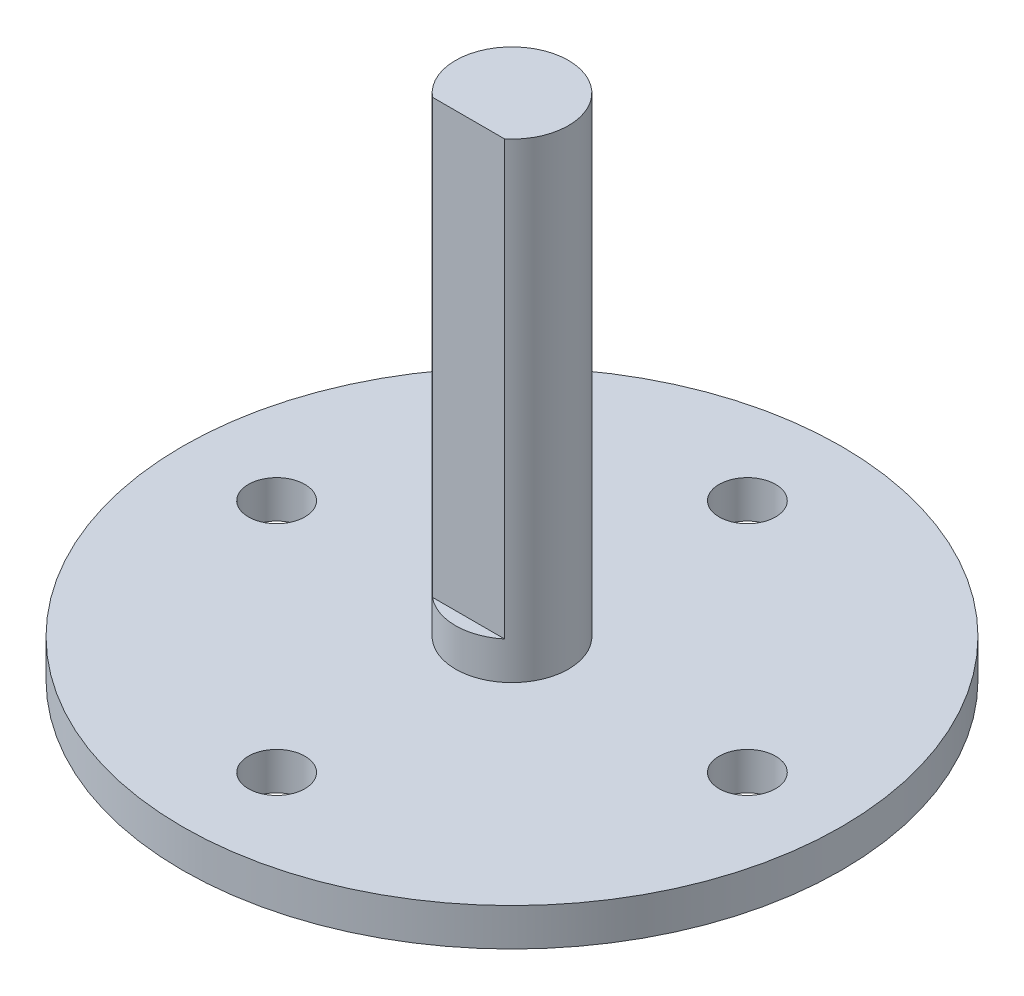
ISO-10303-21;
HEADER;
FILE_DESCRIPTION(('STEP AP214'),'2;1');
FILE_NAME('part.step','',(''),(''),'','','');
FILE_SCHEMA(('AUTOMOTIVE_DESIGN { 1 0 10303 214 1 1 1 1 }'));
ENDSEC;
DATA;
#1=APPLICATION_CONTEXT('core data for automotive mechanical design processes');
#2=APPLICATION_PROTOCOL_DEFINITION('international standard','automotive_design',2000,#1);
#3=PRODUCT_CONTEXT('',#1,'mechanical');
#4=PRODUCT('Part','Part','',(#3));
#5=PRODUCT_RELATED_PRODUCT_CATEGORY('part','',(#4));
#6=PRODUCT_DEFINITION_FORMATION('','',#4);
#7=PRODUCT_DEFINITION_CONTEXT('part definition',#1,'design');
#8=PRODUCT_DEFINITION('design','',#6,#7);
#9=PRODUCT_DEFINITION_SHAPE('','',#8);
#10=(LENGTH_UNIT() NAMED_UNIT(*) SI_UNIT(.MILLI.,.METRE.));
#11=(NAMED_UNIT(*) PLANE_ANGLE_UNIT() SI_UNIT($,.RADIAN.));
#12=(NAMED_UNIT(*) SI_UNIT($,.STERADIAN.) SOLID_ANGLE_UNIT());
#13=UNCERTAINTY_MEASURE_WITH_UNIT(LENGTH_MEASURE(1.E-05),#10,'distance_accuracy_value','');
#14=(GEOMETRIC_REPRESENTATION_CONTEXT(3) GLOBAL_UNCERTAINTY_ASSIGNED_CONTEXT((#13)) GLOBAL_UNIT_ASSIGNED_CONTEXT((#10,
#11,#12)) REPRESENTATION_CONTEXT('',''));
#15=CARTESIAN_POINT('',(0.,0.,0.));
#16=DIRECTION('',(0.,0.,1.));
#17=DIRECTION('',(1.,0.,0.));
#18=AXIS2_PLACEMENT_3D('',#15,#16,#17);
#19=CARTESIAN_POINT('',(0.,2.,0.));
#20=DIRECTION('',(0.,1.,0.));
#21=DIRECTION('',(0.,0.,1.));
#22=AXIS2_PLACEMENT_3D('',#19,#20,#21);
#23=PLANE('',#22);
#24=CARTESIAN_POINT('',(7.05950310263298E-13,2.,12.5));
#25=DIRECTION('',(0.,1.,0.));
#26=DIRECTION('',(0.,0.,1.));
#27=AXIS2_PLACEMENT_3D('',#24,#25,#26);
#28=CIRCLE('',#27,1.5);
#29=CARTESIAN_POINT('',(7.05950310263298E-13,2.,14.));
#30=VERTEX_POINT('',#29);
#31=EDGE_CURVE('E89',#30,#30,#28,.T.);
#32=ORIENTED_EDGE('',*,*,#31,.F.);
#33=EDGE_LOOP('',(#32));
#34=FACE_BOUND('',#33,.T.);
#35=CARTESIAN_POINT('',(0.,2.,-12.5));
#36=DIRECTION('',(0.,1.,0.));
#37=DIRECTION('',(0.,0.,1.));
#38=AXIS2_PLACEMENT_3D('',#35,#36,#37);
#39=CIRCLE('',#38,1.5);
#40=CARTESIAN_POINT('',(0.,2.,-11.));
#41=VERTEX_POINT('',#40);
#42=EDGE_CURVE('E101',#41,#41,#39,.T.);
#43=ORIENTED_EDGE('',*,*,#42,.F.);
#44=EDGE_LOOP('',(#43));
#45=FACE_BOUND('',#44,.T.);
#46=CARTESIAN_POINT('',(0.,2.,0.));
#47=DIRECTION('',(0.,1.,0.));
#48=DIRECTION('',(0.,0.,1.));
#49=AXIS2_PLACEMENT_3D('',#46,#47,#48);
#50=CIRCLE('',#49,17.5);
#51=CARTESIAN_POINT('',(0.,2.,17.5));
#52=VERTEX_POINT('',#51);
#53=EDGE_CURVE('E47',#52,#52,#50,.T.);
#54=ORIENTED_EDGE('',*,*,#53,.T.);
#55=EDGE_LOOP('',(#54));
#56=FACE_BOUND('',#55,.T.);
#57=CARTESIAN_POINT('',(12.5000000000004,2.,-3.52975155131649E-13));
#58=DIRECTION('',(0.,1.,0.));
#59=DIRECTION('',(0.,0.,1.));
#60=AXIS2_PLACEMENT_3D('',#57,#58,#59);
#61=CIRCLE('',#60,1.5);
#62=CARTESIAN_POINT('',(12.5000000000004,2.,1.49999999999965));
#63=VERTEX_POINT('',#62);
#64=EDGE_CURVE('E95',#63,#63,#61,.T.);
#65=ORIENTED_EDGE('',*,*,#64,.F.);
#66=EDGE_LOOP('',(#65));
#67=FACE_BOUND('',#66,.T.);
#68=CARTESIAN_POINT('',(-12.4999999999996,2.,3.54505963630583E-13));
#69=DIRECTION('',(0.,1.,0.));
#70=DIRECTION('',(0.,0.,1.));
#71=AXIS2_PLACEMENT_3D('',#68,#69,#70);
#72=CIRCLE('',#71,1.5);
#73=CARTESIAN_POINT('',(-12.4999999999996,2.,1.50000000000036));
#74=VERTEX_POINT('',#73);
#75=EDGE_CURVE('E81',#74,#74,#72,.T.);
#76=ORIENTED_EDGE('',*,*,#75,.F.);
#77=EDGE_LOOP('',(#76));
#78=FACE_BOUND('',#77,.T.);
#79=CARTESIAN_POINT('',(0.,2.,0.));
#80=DIRECTION('',(0.,1.,0.));
#81=DIRECTION('',(0.,0.,1.));
#82=AXIS2_PLACEMENT_3D('',#79,#80,#81);
#83=CIRCLE('',#82,3.);
#84=CARTESIAN_POINT('',(0.,2.,3.));
#85=VERTEX_POINT('',#84);
#86=EDGE_CURVE('E75',#85,#85,#83,.T.);
#87=ORIENTED_EDGE('',*,*,#86,.F.);
#88=EDGE_LOOP('',(#87));
#89=FACE_BOUND('',#88,.T.);
#90=ADVANCED_FACE('F39',(#34,#45,#56,#67,#78,#89),#23,.T.);
#91=CARTESIAN_POINT('',(0.,0.,0.));
#92=DIRECTION('',(0.,1.,0.));
#93=DIRECTION('',(0.,0.,1.));
#94=AXIS2_PLACEMENT_3D('',#91,#92,#93);
#95=PLANE('',#94);
#96=CARTESIAN_POINT('',(0.,0.,0.));
#97=DIRECTION('',(0.,1.,0.));
#98=DIRECTION('',(0.,0.,1.));
#99=AXIS2_PLACEMENT_3D('',#96,#97,#98);
#100=CIRCLE('',#99,17.5);
#101=CARTESIAN_POINT('',(0.,0.,17.5));
#102=VERTEX_POINT('',#101);
#103=EDGE_CURVE('E104',#102,#102,#100,.T.);
#104=ORIENTED_EDGE('',*,*,#103,.F.);
#105=EDGE_LOOP('',(#104));
#106=FACE_BOUND('',#105,.T.);
#107=CARTESIAN_POINT('',(0.,0.,-12.5));
#108=DIRECTION('',(0.,1.,0.));
#109=DIRECTION('',(0.,0.,1.));
#110=AXIS2_PLACEMENT_3D('',#107,#108,#109);
#111=CIRCLE('',#110,1.5);
#112=CARTESIAN_POINT('',(0.,0.,-11.));
#113=VERTEX_POINT('',#112);
#114=EDGE_CURVE('E98',#113,#113,#111,.T.);
#115=ORIENTED_EDGE('',*,*,#114,.T.);
#116=EDGE_LOOP('',(#115));
#117=FACE_BOUND('',#116,.T.);
#118=CARTESIAN_POINT('',(12.5000000000004,0.,-3.52975155131649E-13));
#119=DIRECTION('',(0.,1.,0.));
#120=DIRECTION('',(0.,0.,1.));
#121=AXIS2_PLACEMENT_3D('',#118,#119,#120);
#122=CIRCLE('',#121,1.5);
#123=CARTESIAN_POINT('',(12.5000000000004,0.,1.49999999999965));
#124=VERTEX_POINT('',#123);
#125=EDGE_CURVE('E92',#124,#124,#122,.T.);
#126=ORIENTED_EDGE('',*,*,#125,.T.);
#127=EDGE_LOOP('',(#126));
#128=FACE_BOUND('',#127,.T.);
#129=CARTESIAN_POINT('',(7.05950310263298E-13,0.,12.5));
#130=DIRECTION('',(0.,1.,0.));
#131=DIRECTION('',(0.,0.,1.));
#132=AXIS2_PLACEMENT_3D('',#129,#130,#131);
#133=CIRCLE('',#132,1.5);
#134=CARTESIAN_POINT('',(7.05950310263298E-13,0.,14.));
#135=VERTEX_POINT('',#134);
#136=EDGE_CURVE('E87',#135,#135,#133,.T.);
#137=ORIENTED_EDGE('',*,*,#136,.T.);
#138=EDGE_LOOP('',(#137));
#139=FACE_BOUND('',#138,.T.);
#140=CARTESIAN_POINT('',(-12.4999999999996,0.,3.54505963630583E-13));
#141=DIRECTION('',(0.,1.,0.));
#142=DIRECTION('',(0.,0.,1.));
#143=AXIS2_PLACEMENT_3D('',#140,#141,#142);
#144=CIRCLE('',#143,1.5);
#145=CARTESIAN_POINT('',(-12.4999999999996,0.,1.50000000000036));
#146=VERTEX_POINT('',#145);
#147=EDGE_CURVE('E78',#146,#146,#144,.T.);
#148=ORIENTED_EDGE('',*,*,#147,.T.);
#149=EDGE_LOOP('',(#148));
#150=FACE_BOUND('',#149,.T.);
#151=ADVANCED_FACE('F112',(#106,#117,#128,#139,#150),#95,.F.);
#152=CARTESIAN_POINT('',(0.,2.,0.));
#153=DIRECTION('',(0.,-1.,0.));
#154=DIRECTION('',(0.,0.,-1.));
#155=AXIS2_PLACEMENT_3D('',#152,#153,#154);
#156=CYLINDRICAL_SURFACE('',#155,17.5);
#157=ORIENTED_EDGE('',*,*,#53,.F.);
#158=EDGE_LOOP('',(#157));
#159=FACE_BOUND('',#158,.T.);
#160=ORIENTED_EDGE('',*,*,#103,.T.);
#161=EDGE_LOOP('',(#160));
#162=FACE_BOUND('',#161,.T.);
#163=ADVANCED_FACE('F41',(#159,#162),#156,.T.);
#164=CARTESIAN_POINT('',(0.,2.,-12.5));
#165=DIRECTION('',(0.,-1.,0.));
#166=DIRECTION('',(0.,0.,-1.));
#167=AXIS2_PLACEMENT_3D('',#164,#165,#166);
#168=CYLINDRICAL_SURFACE('',#167,1.5);
#169=ORIENTED_EDGE('',*,*,#42,.T.);
#170=EDGE_LOOP('',(#169));
#171=FACE_BOUND('',#170,.T.);
#172=ORIENTED_EDGE('',*,*,#114,.F.);
#173=EDGE_LOOP('',(#172));
#174=FACE_BOUND('',#173,.T.);
#175=ADVANCED_FACE('F147',(#171,#174),#168,.F.);
#176=CARTESIAN_POINT('',(12.5000000000004,2.,-3.52975155131649E-13));
#177=DIRECTION('',(0.,-1.,0.));
#178=DIRECTION('',(0.,0.,-1.));
#179=AXIS2_PLACEMENT_3D('',#176,#177,#178);
#180=CYLINDRICAL_SURFACE('',#179,1.5);
#181=ORIENTED_EDGE('',*,*,#64,.T.);
#182=EDGE_LOOP('',(#181));
#183=FACE_BOUND('',#182,.T.);
#184=ORIENTED_EDGE('',*,*,#125,.F.);
#185=EDGE_LOOP('',(#184));
#186=FACE_BOUND('',#185,.T.);
#187=ADVANCED_FACE('F134',(#183,#186),#180,.F.);
#188=CARTESIAN_POINT('',(7.05950310263298E-13,2.,12.5));
#189=DIRECTION('',(0.,-1.,0.));
#190=DIRECTION('',(0.,0.,-1.));
#191=AXIS2_PLACEMENT_3D('',#188,#189,#190);
#192=CYLINDRICAL_SURFACE('',#191,1.5);
#193=ORIENTED_EDGE('',*,*,#31,.T.);
#194=EDGE_LOOP('',(#193));
#195=FACE_BOUND('',#194,.T.);
#196=ORIENTED_EDGE('',*,*,#136,.F.);
#197=EDGE_LOOP('',(#196));
#198=FACE_BOUND('',#197,.T.);
#199=ADVANCED_FACE('F125',(#195,#198),#192,.F.);
#200=CARTESIAN_POINT('',(-12.4999999999996,2.,3.54505963630583E-13));
#201=DIRECTION('',(0.,-1.,0.));
#202=DIRECTION('',(0.,0.,-1.));
#203=AXIS2_PLACEMENT_3D('',#200,#201,#202);
#204=CYLINDRICAL_SURFACE('',#203,1.5);
#205=ORIENTED_EDGE('',*,*,#75,.T.);
#206=EDGE_LOOP('',(#205));
#207=FACE_BOUND('',#206,.T.);
#208=ORIENTED_EDGE('',*,*,#147,.F.);
#209=EDGE_LOOP('',(#208));
#210=FACE_BOUND('',#209,.T.);
#211=ADVANCED_FACE('F123',(#207,#210),#204,.F.);
#212=CARTESIAN_POINT('',(0.,27.,0.));
#213=DIRECTION('',(0.,-1.,0.));
#214=DIRECTION('',(0.,0.,-1.));
#215=AXIS2_PLACEMENT_3D('',#212,#213,#214);
#216=CYLINDRICAL_SURFACE('',#215,3.);
#217=DIRECTION('',(0.,-1.,0.));
#218=VECTOR('',#217,1.);
#219=CARTESIAN_POINT('',(1.91669452533406,27.,2.3078739342855));
#220=LINE('',#219,#218);
#221=CARTESIAN_POINT('',(1.91669452533406,27.,2.3078739342855));
#222=VERTEX_POINT('',#221);
#223=CARTESIAN_POINT('',(1.91669452533406,4.,2.3078739342855));
#224=VERTEX_POINT('',#223);
#225=EDGE_CURVE('E74',#222,#224,#220,.T.);
#226=ORIENTED_EDGE('',*,*,#225,.T.);
#227=CARTESIAN_POINT('',(0.,4.,0.));
#228=DIRECTION('',(0.,1.,0.));
#229=DIRECTION('',(0.,0.,1.));
#230=AXIS2_PLACEMENT_3D('',#227,#228,#229);
#231=CIRCLE('',#230,3.);
#232=CARTESIAN_POINT('',(-1.91669452533406,4.,2.3078739342855));
#233=VERTEX_POINT('',#232);
#234=EDGE_CURVE('E53',#233,#224,#231,.T.);
#235=ORIENTED_EDGE('',*,*,#234,.F.);
#236=DIRECTION('',(0.,-1.,0.));
#237=VECTOR('',#236,1.);
#238=CARTESIAN_POINT('',(-1.91669452533406,27.,2.3078739342855));
#239=LINE('',#238,#237);
#240=CARTESIAN_POINT('',(-1.91669452533406,27.,2.3078739342855));
#241=VERTEX_POINT('',#240);
#242=EDGE_CURVE('E73',#241,#233,#239,.T.);
#243=ORIENTED_EDGE('',*,*,#242,.F.);
#244=CARTESIAN_POINT('',(0.,27.,0.));
#245=DIRECTION('',(0.,1.,0.));
#246=DIRECTION('',(0.,0.,1.));
#247=AXIS2_PLACEMENT_3D('',#244,#245,#246);
#248=CIRCLE('',#247,3.);
#249=EDGE_CURVE('E163',#222,#241,#248,.T.);
#250=ORIENTED_EDGE('',*,*,#249,.F.);
#251=EDGE_LOOP('',(#226,#235,#243,#250));
#252=FACE_BOUND('',#251,.T.);
#253=ORIENTED_EDGE('',*,*,#86,.T.);
#254=EDGE_LOOP('',(#253));
#255=FACE_BOUND('',#254,.T.);
#256=ADVANCED_FACE('F70',(#252,#255),#216,.T.);
#257=CARTESIAN_POINT('',(-1.91669452533406,27.,2.3078739342855));
#258=DIRECTION('',(0.,0.,-1.));
#259=DIRECTION('',(-1.,0.,0.));
#260=AXIS2_PLACEMENT_3D('',#257,#258,#259);
#261=PLANE('',#260);
#262=ORIENTED_EDGE('',*,*,#242,.T.);
#263=DIRECTION('',(1.,0.,0.));
#264=VECTOR('',#263,1.);
#265=CARTESIAN_POINT('',(-1.91669452533406,4.,2.3078739342855));
#266=LINE('',#265,#264);
#267=EDGE_CURVE('E11',#233,#224,#266,.T.);
#268=ORIENTED_EDGE('',*,*,#267,.T.);
#269=ORIENTED_EDGE('',*,*,#225,.F.);
#270=DIRECTION('',(1.,0.,0.));
#271=VECTOR('',#270,1.);
#272=CARTESIAN_POINT('',(-1.91669452533406,27.,2.3078739342855));
#273=LINE('',#272,#271);
#274=EDGE_CURVE('E59',#241,#222,#273,.T.);
#275=ORIENTED_EDGE('',*,*,#274,.F.);
#276=EDGE_LOOP('',(#262,#268,#269,#275));
#277=FACE_BOUND('',#276,.T.);
#278=ADVANCED_FACE('F77',(#277),#261,.F.);
#279=CARTESIAN_POINT('',(0.,27.,0.));
#280=DIRECTION('',(0.,1.,0.));
#281=DIRECTION('',(0.,0.,1.));
#282=AXIS2_PLACEMENT_3D('',#279,#280,#281);
#283=PLANE('',#282);
#284=ORIENTED_EDGE('',*,*,#249,.T.);
#285=ORIENTED_EDGE('',*,*,#274,.T.);
#286=EDGE_LOOP('',(#284,#285));
#287=FACE_BOUND('',#286,.T.);
#288=ADVANCED_FACE('F166',(#287),#283,.T.);
#289=CARTESIAN_POINT('',(0.,4.,0.));
#290=DIRECTION('',(0.,1.,0.));
#291=DIRECTION('',(0.,0.,1.));
#292=AXIS2_PLACEMENT_3D('',#289,#290,#291);
#293=PLANE('',#292);
#294=ORIENTED_EDGE('',*,*,#267,.F.);
#295=ORIENTED_EDGE('',*,*,#234,.T.);
#296=EDGE_LOOP('',(#294,#295));
#297=FACE_BOUND('',#296,.T.);
#298=ADVANCED_FACE('F64',(#297),#293,.T.);
#299=CLOSED_SHELL('',(#90,#151,#163,#175,#187,#199,#211,#256,#278,#288,#298));
#300=MANIFOLD_SOLID_BREP('B2',#299);
#301=ADVANCED_BREP_SHAPE_REPRESENTATION('',(#18,#300),#14);
#302=SHAPE_DEFINITION_REPRESENTATION(#9,#301);
ENDSEC;
END-ISO-10303-21;
